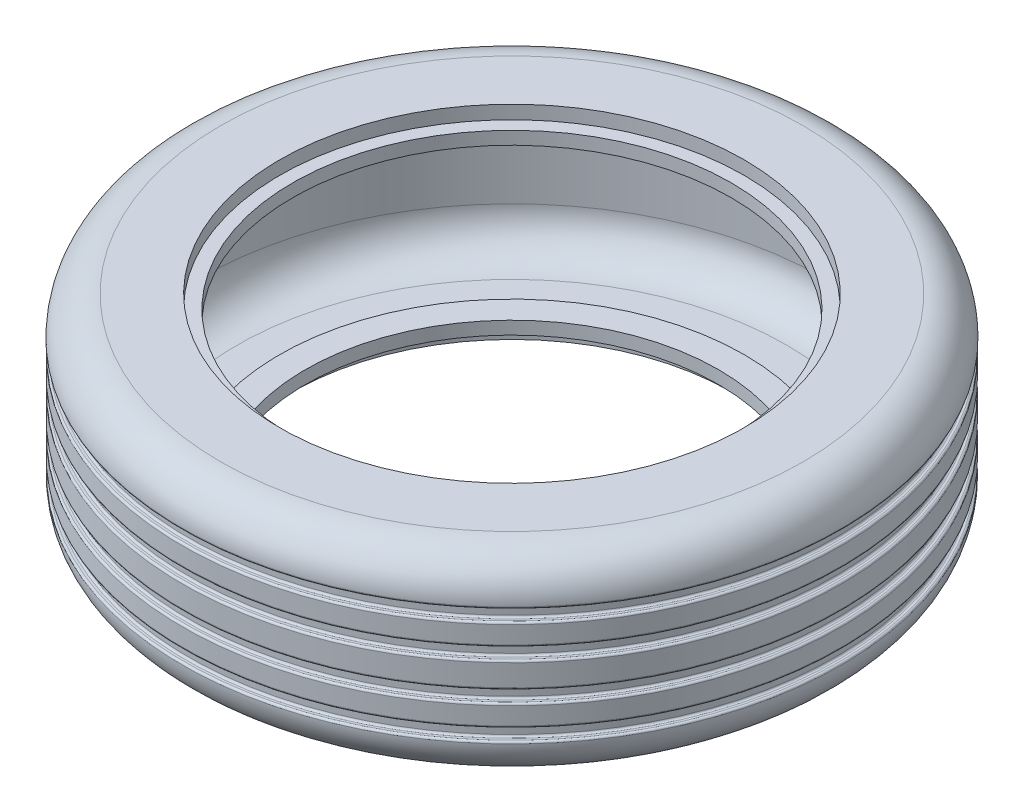
ISO-10303-21;
HEADER;
FILE_DESCRIPTION(('STEP AP214'),'2;1');
FILE_NAME('part.step','',(''),(''),'','','');
FILE_SCHEMA(('AUTOMOTIVE_DESIGN { 1 0 10303 214 1 1 1 1 }'));
ENDSEC;
DATA;
#1=APPLICATION_CONTEXT('core data for automotive mechanical design processes');
#2=APPLICATION_PROTOCOL_DEFINITION('international standard','automotive_design',2000,#1);
#3=PRODUCT_CONTEXT('',#1,'mechanical');
#4=PRODUCT('Part','Part','',(#3));
#5=PRODUCT_RELATED_PRODUCT_CATEGORY('part','',(#4));
#6=PRODUCT_DEFINITION_FORMATION('','',#4);
#7=PRODUCT_DEFINITION_CONTEXT('part definition',#1,'design');
#8=PRODUCT_DEFINITION('design','',#6,#7);
#9=PRODUCT_DEFINITION_SHAPE('','',#8);
#10=(LENGTH_UNIT() NAMED_UNIT(*) SI_UNIT(.MILLI.,.METRE.));
#11=(NAMED_UNIT(*) PLANE_ANGLE_UNIT() SI_UNIT($,.RADIAN.));
#12=(NAMED_UNIT(*) SI_UNIT($,.STERADIAN.) SOLID_ANGLE_UNIT());
#13=UNCERTAINTY_MEASURE_WITH_UNIT(LENGTH_MEASURE(1.E-05),#10,'distance_accuracy_value','');
#14=(GEOMETRIC_REPRESENTATION_CONTEXT(3) GLOBAL_UNCERTAINTY_ASSIGNED_CONTEXT((#13)) GLOBAL_UNIT_ASSIGNED_CONTEXT((#10,
#11,#12)) REPRESENTATION_CONTEXT('',''));
#15=CARTESIAN_POINT('',(0.,0.,0.));
#16=DIRECTION('',(0.,0.,1.));
#17=DIRECTION('',(1.,0.,0.));
#18=AXIS2_PLACEMENT_3D('',#15,#16,#17);
#19=CARTESIAN_POINT('',(0.,50.4745167200062,204.0325899541));
#20=DIRECTION('',(0.,1.,0.));
#21=DIRECTION('',(0.,0.,1.));
#22=AXIS2_PLACEMENT_3D('',#19,#20,#21);
#23=PLANE('',#22);
#24=CARTESIAN_POINT('',(0.,50.4745167200062,-135.611854490345));
#25=DIRECTION('',(0.,-1.,0.));
#26=DIRECTION('',(0.,0.,-1.));
#27=AXIS2_PLACEMENT_3D('',#24,#25,#26);
#28=CIRCLE('',#27,339.644444444444);
#29=CARTESIAN_POINT('',(0.,50.4745167200062,-475.256298934789));
#30=VERTEX_POINT('',#29);
#31=EDGE_CURVE('E246',#30,#30,#28,.T.);
#32=ORIENTED_EDGE('',*,*,#31,.F.);
#33=EDGE_LOOP('',(#32));
#34=FACE_BOUND('',#33,.T.);
#35=CARTESIAN_POINT('',(0.,50.4745167200062,-135.611854490345));
#36=DIRECTION('',(0.,-1.,0.));
#37=DIRECTION('',(0.,0.,-1.));
#38=AXIS2_PLACEMENT_3D('',#35,#36,#37);
#39=CIRCLE('',#38,379.644444444444);
#40=CARTESIAN_POINT('',(0.,50.4745167200062,-515.256298934789));
#41=VERTEX_POINT('',#40);
#42=EDGE_CURVE('E10',#41,#41,#39,.T.);
#43=ORIENTED_EDGE('',*,*,#42,.T.);
#44=EDGE_LOOP('',(#43));
#45=FACE_BOUND('',#44,.T.);
#46=ADVANCED_FACE('F43',(#34,#45),#23,.F.);
#47=CARTESIAN_POINT('',(0.,-170.345483279994,-135.611854490345));
#48=DIRECTION('',(0.,-1.,0.));
#49=DIRECTION('',(0.,0.,-1.));
#50=AXIS2_PLACEMENT_3D('',#47,#48,#49);
#51=CYLINDRICAL_SURFACE('',#50,379.644444444444);
#52=ORIENTED_EDGE('',*,*,#42,.F.);
#53=EDGE_LOOP('',(#52));
#54=FACE_BOUND('',#53,.T.);
#55=CARTESIAN_POINT('',(0.,70.4745167200063,-135.611854490345));
#56=DIRECTION('',(0.,-1.,0.));
#57=DIRECTION('',(0.,0.,-1.));
#58=AXIS2_PLACEMENT_3D('',#55,#56,#57);
#59=CIRCLE('',#58,379.644444444444);
#60=CARTESIAN_POINT('',(0.,70.4745167200063,-515.256298934789));
#61=VERTEX_POINT('',#60);
#62=EDGE_CURVE('E50',#61,#61,#59,.T.);
#63=ORIENTED_EDGE('',*,*,#62,.T.);
#64=EDGE_LOOP('',(#63));
#65=FACE_BOUND('',#64,.T.);
#66=ADVANCED_FACE('F254',(#54,#65),#51,.T.);
#67=CARTESIAN_POINT('',(0.,70.4745167200063,244.0325899541));
#68=DIRECTION('',(0.,1.,0.));
#69=DIRECTION('',(0.,0.,1.));
#70=AXIS2_PLACEMENT_3D('',#67,#68,#69);
#71=PLANE('',#70);
#72=ORIENTED_EDGE('',*,*,#62,.F.);
#73=EDGE_LOOP('',(#72));
#74=FACE_BOUND('',#73,.T.);
#75=CARTESIAN_POINT('',(0.,70.4745167200063,-135.611854490345));
#76=DIRECTION('',(0.,-1.,0.));
#77=DIRECTION('',(0.,0.,-1.));
#78=AXIS2_PLACEMENT_3D('',#75,#76,#77);
#79=CIRCLE('',#78,425.644444444444);
#80=CARTESIAN_POINT('',(0.,70.4745167200063,-561.256298934789));
#81=VERTEX_POINT('',#80);
#82=EDGE_CURVE('E55',#81,#81,#79,.T.);
#83=ORIENTED_EDGE('',*,*,#82,.T.);
#84=EDGE_LOOP('',(#83));
#85=FACE_BOUND('',#84,.T.);
#86=ADVANCED_FACE('F258',(#74,#85),#71,.F.);
#87=CARTESIAN_POINT('',(0.,11.0645167200063,-135.611854490345));
#88=DIRECTION('',(0.,-1.,0.));
#89=DIRECTION('',(0.,0.,-1.));
#90=AXIS2_PLACEMENT_3D('',#87,#88,#89);
#91=TOROIDAL_SURFACE('',#90,425.644444444444,59.41);
#92=ORIENTED_EDGE('',*,*,#82,.F.);
#93=EDGE_LOOP('',(#92));
#94=FACE_BOUND('',#93,.T.);
#95=CARTESIAN_POINT('',(0.,11.0645167200063,-135.611854490345));
#96=DIRECTION('',(0.,-1.,0.));
#97=DIRECTION('',(0.,0.,-1.));
#98=AXIS2_PLACEMENT_3D('',#95,#96,#97);
#99=CIRCLE('',#98,485.054444444444);
#100=CARTESIAN_POINT('',(0.,11.0645167200063,-620.666298934789));
#101=VERTEX_POINT('',#100);
#102=EDGE_CURVE('E60',#101,#101,#99,.T.);
#103=ORIENTED_EDGE('',*,*,#102,.T.);
#104=EDGE_LOOP('',(#103));
#105=FACE_BOUND('',#104,.T.);
#106=ADVANCED_FACE('F263',(#94,#105),#91,.F.);
#107=CARTESIAN_POINT('',(0.,-170.345483279994,-135.611854490345));
#108=DIRECTION('',(0.,-1.,0.));
#109=DIRECTION('',(0.,0.,-1.));
#110=AXIS2_PLACEMENT_3D('',#107,#108,#109);
#111=CYLINDRICAL_SURFACE('',#110,485.054444444444);
#112=ORIENTED_EDGE('',*,*,#102,.F.);
#113=EDGE_LOOP('',(#112));
#114=FACE_BOUND('',#113,.T.);
#115=CARTESIAN_POINT('',(0.,-130.935483279994,-135.611854490345));
#116=DIRECTION('',(0.,-1.,0.));
#117=DIRECTION('',(0.,0.,-1.));
#118=AXIS2_PLACEMENT_3D('',#115,#116,#117);
#119=CIRCLE('',#118,485.054444444444);
#120=CARTESIAN_POINT('',(0.,-130.935483279994,-620.666298934789));
#121=VERTEX_POINT('',#120);
#122=EDGE_CURVE('E66',#121,#121,#119,.T.);
#123=ORIENTED_EDGE('',*,*,#122,.T.);
#124=EDGE_LOOP('',(#123));
#125=FACE_BOUND('',#124,.T.);
#126=ADVANCED_FACE('F269',(#114,#125),#111,.F.);
#127=CARTESIAN_POINT('',(0.,-130.935483279994,-135.611854490345));
#128=DIRECTION('',(0.,-1.,0.));
#129=DIRECTION('',(0.,0.,-1.));
#130=AXIS2_PLACEMENT_3D('',#127,#128,#129);
#131=TOROIDAL_SURFACE('',#130,425.644444444444,59.41);
#132=ORIENTED_EDGE('',*,*,#122,.F.);
#133=EDGE_LOOP('',(#132));
#134=FACE_BOUND('',#133,.T.);
#135=CARTESIAN_POINT('',(0.,-190.345483279994,-135.611854490345));
#136=DIRECTION('',(0.,-1.,0.));
#137=DIRECTION('',(0.,0.,-1.));
#138=AXIS2_PLACEMENT_3D('',#135,#136,#137);
#139=CIRCLE('',#138,425.644444444444);
#140=CARTESIAN_POINT('',(0.,-190.345483279994,-561.256298934789));
#141=VERTEX_POINT('',#140);
#142=EDGE_CURVE('E70',#141,#141,#139,.T.);
#143=ORIENTED_EDGE('',*,*,#142,.T.);
#144=EDGE_LOOP('',(#143));
#145=FACE_BOUND('',#144,.T.);
#146=ADVANCED_FACE('F273',(#134,#145),#131,.F.);
#147=CARTESIAN_POINT('',(0.,-190.345483279994,224.388145509655));
#148=DIRECTION('',(0.,-1.,0.));
#149=DIRECTION('',(0.,0.,-1.));
#150=AXIS2_PLACEMENT_3D('',#147,#148,#149);
#151=PLANE('',#150);
#152=ORIENTED_EDGE('',*,*,#142,.F.);
#153=EDGE_LOOP('',(#152));
#154=FACE_BOUND('',#153,.T.);
#155=CARTESIAN_POINT('',(0.,-190.345483279994,-135.611854490345));
#156=DIRECTION('',(0.,-1.,0.));
#157=DIRECTION('',(0.,0.,-1.));
#158=AXIS2_PLACEMENT_3D('',#155,#156,#157);
#159=CIRCLE('',#158,360.);
#160=CARTESIAN_POINT('',(0.,-190.345483279994,-495.611854490345));
#161=VERTEX_POINT('',#160);
#162=EDGE_CURVE('E74',#161,#161,#159,.T.);
#163=ORIENTED_EDGE('',*,*,#162,.T.);
#164=EDGE_LOOP('',(#163));
#165=FACE_BOUND('',#164,.T.);
#166=ADVANCED_FACE('F277',(#154,#165),#151,.F.);
#167=CARTESIAN_POINT('',(0.,-170.345483279994,-135.611854490345));
#168=DIRECTION('',(0.,-1.,0.));
#169=DIRECTION('',(0.,0.,-1.));
#170=AXIS2_PLACEMENT_3D('',#167,#168,#169);
#171=CYLINDRICAL_SURFACE('',#170,360.);
#172=ORIENTED_EDGE('',*,*,#162,.F.);
#173=EDGE_LOOP('',(#172));
#174=FACE_BOUND('',#173,.T.);
#175=CARTESIAN_POINT('',(0.,-170.345483279994,-135.611854490345));
#176=DIRECTION('',(0.,-1.,0.));
#177=DIRECTION('',(0.,0.,-1.));
#178=AXIS2_PLACEMENT_3D('',#175,#176,#177);
#179=CIRCLE('',#178,360.);
#180=CARTESIAN_POINT('',(0.,-170.345483279994,-495.611854490345));
#181=VERTEX_POINT('',#180);
#182=EDGE_CURVE('E78',#181,#181,#179,.T.);
#183=ORIENTED_EDGE('',*,*,#182,.T.);
#184=EDGE_LOOP('',(#183));
#185=FACE_BOUND('',#184,.T.);
#186=ADVANCED_FACE('F281',(#174,#185),#171,.T.);
#187=CARTESIAN_POINT('',(0.,-170.345483279994,184.388145509655));
#188=DIRECTION('',(0.,-1.,0.));
#189=DIRECTION('',(0.,0.,-1.));
#190=AXIS2_PLACEMENT_3D('',#187,#188,#189);
#191=PLANE('',#190);
#192=ORIENTED_EDGE('',*,*,#182,.F.);
#193=EDGE_LOOP('',(#192));
#194=FACE_BOUND('',#193,.T.);
#195=CARTESIAN_POINT('',(0.,-170.345483279994,-135.611854490345));
#196=DIRECTION('',(0.,-1.,0.));
#197=DIRECTION('',(0.,0.,-1.));
#198=AXIS2_PLACEMENT_3D('',#195,#196,#197);
#199=CIRCLE('',#198,320.);
#200=CARTESIAN_POINT('',(0.,-170.345483279994,-455.611854490345));
#201=VERTEX_POINT('',#200);
#202=EDGE_CURVE('E82',#201,#201,#199,.T.);
#203=ORIENTED_EDGE('',*,*,#202,.T.);
#204=EDGE_LOOP('',(#203));
#205=FACE_BOUND('',#204,.T.);
#206=ADVANCED_FACE('F285',(#194,#205),#191,.F.);
#207=CARTESIAN_POINT('',(0.,-170.345483279994,-135.611854490345));
#208=DIRECTION('',(0.,-1.,0.));
#209=DIRECTION('',(0.,0.,-1.));
#210=AXIS2_PLACEMENT_3D('',#207,#208,#209);
#211=CYLINDRICAL_SURFACE('',#210,320.);
#212=ORIENTED_EDGE('',*,*,#202,.F.);
#213=EDGE_LOOP('',(#212));
#214=FACE_BOUND('',#213,.T.);
#215=CARTESIAN_POINT('',(0.,-190.345483279994,-135.611854490345));
#216=DIRECTION('',(0.,-1.,0.));
#217=DIRECTION('',(0.,0.,-1.));
#218=AXIS2_PLACEMENT_3D('',#215,#216,#217);
#219=CIRCLE('',#218,320.);
#220=CARTESIAN_POINT('',(0.,-190.345483279994,-455.611854490345));
#221=VERTEX_POINT('',#220);
#222=EDGE_CURVE('E86',#221,#221,#219,.T.);
#223=ORIENTED_EDGE('',*,*,#222,.T.);
#224=EDGE_LOOP('',(#223));
#225=FACE_BOUND('',#224,.T.);
#226=ADVANCED_FACE('F289',(#214,#225),#211,.F.);
#227=CARTESIAN_POINT('',(0.,-190.345483279994,204.388145509655));
#228=DIRECTION('',(0.,1.,0.));
#229=DIRECTION('',(0.,0.,1.));
#230=AXIS2_PLACEMENT_3D('',#227,#228,#229);
#231=PLANE('',#230);
#232=ORIENTED_EDGE('',*,*,#222,.F.);
#233=EDGE_LOOP('',(#232));
#234=FACE_BOUND('',#233,.T.);
#235=CARTESIAN_POINT('',(0.,-190.345483279994,-135.611854490345));
#236=DIRECTION('',(0.,-1.,0.));
#237=DIRECTION('',(0.,0.,-1.));
#238=AXIS2_PLACEMENT_3D('',#235,#236,#237);
#239=CIRCLE('',#238,340.);
#240=CARTESIAN_POINT('',(0.,-190.345483279994,-475.611854490345));
#241=VERTEX_POINT('',#240);
#242=EDGE_CURVE('E90',#241,#241,#239,.T.);
#243=ORIENTED_EDGE('',*,*,#242,.T.);
#244=EDGE_LOOP('',(#243));
#245=FACE_BOUND('',#244,.T.);
#246=ADVANCED_FACE('F293',(#234,#245),#231,.F.);
#247=CARTESIAN_POINT('',(0.,-170.345483279994,-135.611854490345));
#248=DIRECTION('',(0.,-1.,0.));
#249=DIRECTION('',(0.,0.,-1.));
#250=AXIS2_PLACEMENT_3D('',#247,#248,#249);
#251=CYLINDRICAL_SURFACE('',#250,340.);
#252=ORIENTED_EDGE('',*,*,#242,.F.);
#253=EDGE_LOOP('',(#252));
#254=FACE_BOUND('',#253,.T.);
#255=CARTESIAN_POINT('',(0.,-210.345483279994,-135.611854490345));
#256=DIRECTION('',(0.,-1.,0.));
#257=DIRECTION('',(0.,0.,-1.));
#258=AXIS2_PLACEMENT_3D('',#255,#256,#257);
#259=CIRCLE('',#258,340.);
#260=CARTESIAN_POINT('',(0.,-210.345483279994,-475.611854490345));
#261=VERTEX_POINT('',#260);
#262=EDGE_CURVE('E94',#261,#261,#259,.T.);
#263=ORIENTED_EDGE('',*,*,#262,.T.);
#264=EDGE_LOOP('',(#263));
#265=FACE_BOUND('',#264,.T.);
#266=ADVANCED_FACE('F297',(#254,#265),#251,.F.);
#267=CARTESIAN_POINT('',(0.,-210.345483279994,315.032589954099));
#268=DIRECTION('',(0.,1.,0.));
#269=DIRECTION('',(0.,0.,1.));
#270=AXIS2_PLACEMENT_3D('',#267,#268,#269);
#271=PLANE('',#270);
#272=ORIENTED_EDGE('',*,*,#262,.F.);
#273=EDGE_LOOP('',(#272));
#274=FACE_BOUND('',#273,.T.);
#275=CARTESIAN_POINT('',(0.,-210.345483279994,-135.611854490345));
#276=DIRECTION('',(0.,-1.,0.));
#277=DIRECTION('',(0.,0.,-1.));
#278=AXIS2_PLACEMENT_3D('',#275,#276,#277);
#279=CIRCLE('',#278,450.644444444444);
#280=CARTESIAN_POINT('',(0.,-210.345483279994,-586.256298934789));
#281=VERTEX_POINT('',#280);
#282=EDGE_CURVE('E98',#281,#281,#279,.T.);
#283=ORIENTED_EDGE('',*,*,#282,.T.);
#284=EDGE_LOOP('',(#283));
#285=FACE_BOUND('',#284,.T.);
#286=ADVANCED_FACE('F301',(#274,#285),#271,.F.);
#287=CARTESIAN_POINT('',(0.,-150.935483279994,-135.611854490345));
#288=DIRECTION('',(0.,-1.,0.));
#289=DIRECTION('',(0.,0.,-1.));
#290=AXIS2_PLACEMENT_3D('',#287,#288,#289);
#291=TOROIDAL_SURFACE('',#290,450.644444444444,59.41);
#292=ORIENTED_EDGE('',*,*,#282,.F.);
#293=EDGE_LOOP('',(#292));
#294=FACE_BOUND('',#293,.T.);
#295=CARTESIAN_POINT('',(0.,-151.996376137136,-135.611854490345));
#296=DIRECTION('',(0.,-1.,0.));
#297=DIRECTION('',(0.,0.,-1.));
#298=AXIS2_PLACEMENT_3D('',#295,#296,#297);
#299=CIRCLE('',#298,510.044971431548);
#300=CARTESIAN_POINT('',(0.,-151.996376137136,-645.656825921893));
#301=VERTEX_POINT('',#300);
#302=EDGE_CURVE('E102',#301,#301,#299,.T.);
#303=ORIENTED_EDGE('',*,*,#302,.T.);
#304=EDGE_LOOP('',(#303));
#305=FACE_BOUND('',#304,.T.);
#306=ADVANCED_FACE('F305',(#294,#305),#291,.T.);
#307=CARTESIAN_POINT('',(0.,-151.942804708565,-135.611854490345));
#308=DIRECTION('',(0.,-1.,0.));
#309=DIRECTION('',(0.,0.,-1.));
#310=AXIS2_PLACEMENT_3D('',#307,#308,#309);
#311=TOROIDAL_SURFACE('',#310,507.045449786012,3.00000000000001);
#312=ORIENTED_EDGE('',*,*,#302,.F.);
#313=EDGE_LOOP('',(#312));
#314=FACE_BOUND('',#313,.T.);
#315=CARTESIAN_POINT('',(0.,-148.942804708565,-135.611854490345));
#316=DIRECTION('',(0.,-1.,0.));
#317=DIRECTION('',(0.,0.,-1.));
#318=AXIS2_PLACEMENT_3D('',#315,#316,#317);
#319=CIRCLE('',#318,507.045449786012);
#320=CARTESIAN_POINT('',(0.,-148.942804708565,-642.657304276357));
#321=VERTEX_POINT('',#320);
#322=EDGE_CURVE('E106',#321,#321,#319,.T.);
#323=ORIENTED_EDGE('',*,*,#322,.T.);
#324=EDGE_LOOP('',(#323));
#325=FACE_BOUND('',#324,.T.);
#326=ADVANCED_FACE('F309',(#314,#325),#311,.T.);
#327=CARTESIAN_POINT('',(0.,-148.942804708565,371.433595295667));
#328=DIRECTION('',(0.,-1.,0.));
#329=DIRECTION('',(0.,0.,-1.));
#330=AXIS2_PLACEMENT_3D('',#327,#328,#329);
#331=PLANE('',#330);
#332=ORIENTED_EDGE('',*,*,#322,.F.);
#333=EDGE_LOOP('',(#332));
#334=FACE_BOUND('',#333,.T.);
#335=CARTESIAN_POINT('',(0.,-148.942804708565,-135.611854490345));
#336=DIRECTION('',(0.,-1.,0.));
#337=DIRECTION('',(0.,0.,-1.));
#338=AXIS2_PLACEMENT_3D('',#335,#336,#337);
#339=CIRCLE('',#338,503.565870994142);
#340=CARTESIAN_POINT('',(0.,-148.942804708565,-639.177725484487));
#341=VERTEX_POINT('',#340);
#342=EDGE_CURVE('E110',#341,#341,#339,.T.);
#343=ORIENTED_EDGE('',*,*,#342,.T.);
#344=EDGE_LOOP('',(#343));
#345=FACE_BOUND('',#344,.T.);
#346=ADVANCED_FACE('F313',(#334,#345),#331,.F.);
#347=CARTESIAN_POINT('',(0.,-145.942804708565,-135.611854490345));
#348=DIRECTION('',(0.,-1.,0.));
#349=DIRECTION('',(0.,0.,-1.));
#350=AXIS2_PLACEMENT_3D('',#347,#348,#349);
#351=TOROIDAL_SURFACE('',#350,503.565870994142,3.);
#352=ORIENTED_EDGE('',*,*,#342,.F.);
#353=EDGE_LOOP('',(#352));
#354=FACE_BOUND('',#353,.T.);
#355=CARTESIAN_POINT('',(0.,-145.942804708565,-135.611854490345));
#356=DIRECTION('',(0.,-1.,0.));
#357=DIRECTION('',(0.,0.,-1.));
#358=AXIS2_PLACEMENT_3D('',#355,#356,#357);
#359=CIRCLE('',#358,500.565870994142);
#360=CARTESIAN_POINT('',(0.,-145.942804708565,-636.177725484487));
#361=VERTEX_POINT('',#360);
#362=EDGE_CURVE('E114',#361,#361,#359,.T.);
#363=ORIENTED_EDGE('',*,*,#362,.T.);
#364=EDGE_LOOP('',(#363));
#365=FACE_BOUND('',#364,.T.);
#366=ADVANCED_FACE('F317',(#354,#365),#351,.F.);
#367=CARTESIAN_POINT('',(0.,-170.345483279994,-135.611854490345));
#368=DIRECTION('',(0.,-1.,0.));
#369=DIRECTION('',(0.,0.,-1.));
#370=AXIS2_PLACEMENT_3D('',#367,#368,#369);
#371=CYLINDRICAL_SURFACE('',#370,500.565870994142);
#372=ORIENTED_EDGE('',*,*,#362,.F.);
#373=EDGE_LOOP('',(#372));
#374=FACE_BOUND('',#373,.T.);
#375=CARTESIAN_POINT('',(0.,-133.942804708565,-135.611854490345));
#376=DIRECTION('',(0.,-1.,0.));
#377=DIRECTION('',(0.,0.,-1.));
#378=AXIS2_PLACEMENT_3D('',#375,#376,#377);
#379=CIRCLE('',#378,500.565870994142);
#380=CARTESIAN_POINT('',(0.,-133.942804708565,-636.177725484487));
#381=VERTEX_POINT('',#380);
#382=EDGE_CURVE('E118',#381,#381,#379,.T.);
#383=ORIENTED_EDGE('',*,*,#382,.T.);
#384=EDGE_LOOP('',(#383));
#385=FACE_BOUND('',#384,.T.);
#386=ADVANCED_FACE('F321',(#374,#385),#371,.T.);
#387=CARTESIAN_POINT('',(0.,-133.942804708565,-135.611854490345));
#388=DIRECTION('',(0.,-1.,0.));
#389=DIRECTION('',(0.,0.,-1.));
#390=AXIS2_PLACEMENT_3D('',#387,#388,#389);
#391=TOROIDAL_SURFACE('',#390,503.565870994142,2.99999999999999);
#392=ORIENTED_EDGE('',*,*,#382,.F.);
#393=EDGE_LOOP('',(#392));
#394=FACE_BOUND('',#393,.T.);
#395=CARTESIAN_POINT('',(0.,-130.942804708565,-135.611854490345));
#396=DIRECTION('',(0.,-1.,0.));
#397=DIRECTION('',(0.,0.,-1.));
#398=AXIS2_PLACEMENT_3D('',#395,#396,#397);
#399=CIRCLE('',#398,503.565870994142);
#400=CARTESIAN_POINT('',(0.,-130.942804708565,-639.177725484487));
#401=VERTEX_POINT('',#400);
#402=EDGE_CURVE('E122',#401,#401,#399,.T.);
#403=ORIENTED_EDGE('',*,*,#402,.T.);
#404=EDGE_LOOP('',(#403));
#405=FACE_BOUND('',#404,.T.);
#406=ADVANCED_FACE('F325',(#394,#405),#391,.F.);
#407=CARTESIAN_POINT('',(0.,-130.942804708565,371.442524578989));
#408=DIRECTION('',(0.,1.,0.));
#409=DIRECTION('',(0.,0.,1.));
#410=AXIS2_PLACEMENT_3D('',#407,#408,#409);
#411=PLANE('',#410);
#412=ORIENTED_EDGE('',*,*,#402,.F.);
#413=EDGE_LOOP('',(#412));
#414=FACE_BOUND('',#413,.T.);
#415=CARTESIAN_POINT('',(0.,-130.942804708565,-135.611854490345));
#416=DIRECTION('',(0.,-1.,0.));
#417=DIRECTION('',(0.,0.,-1.));
#418=AXIS2_PLACEMENT_3D('',#415,#416,#417);
#419=CIRCLE('',#418,507.054379069334);
#420=CARTESIAN_POINT('',(0.,-130.942804708565,-642.666233559679));
#421=VERTEX_POINT('',#420);
#422=EDGE_CURVE('E126',#421,#421,#419,.T.);
#423=ORIENTED_EDGE('',*,*,#422,.T.);
#424=EDGE_LOOP('',(#423));
#425=FACE_BOUND('',#424,.T.);
#426=ADVANCED_FACE('F329',(#414,#425),#411,.F.);
#427=CARTESIAN_POINT('',(0.,-127.942804708565,-135.611854490345));
#428=DIRECTION('',(0.,-1.,0.));
#429=DIRECTION('',(0.,0.,-1.));
#430=AXIS2_PLACEMENT_3D('',#427,#428,#429);
#431=TOROIDAL_SURFACE('',#430,507.054379069334,3.);
#432=ORIENTED_EDGE('',*,*,#422,.F.);
#433=EDGE_LOOP('',(#432));
#434=FACE_BOUND('',#433,.T.);
#435=CARTESIAN_POINT('',(0.,-127.942804708565,-135.611854490345));
#436=DIRECTION('',(0.,-1.,0.));
#437=DIRECTION('',(0.,0.,-1.));
#438=AXIS2_PLACEMENT_3D('',#435,#436,#437);
#439=CIRCLE('',#438,510.054379069334);
#440=CARTESIAN_POINT('',(0.,-127.942804708565,-645.666233559679));
#441=VERTEX_POINT('',#440);
#442=EDGE_CURVE('E130',#441,#441,#439,.T.);
#443=ORIENTED_EDGE('',*,*,#442,.T.);
#444=EDGE_LOOP('',(#443));
#445=FACE_BOUND('',#444,.T.);
#446=ADVANCED_FACE('F333',(#434,#445),#431,.T.);
#447=CARTESIAN_POINT('',(0.,-170.345483279994,-135.611854490345));
#448=DIRECTION('',(0.,-1.,0.));
#449=DIRECTION('',(0.,0.,-1.));
#450=AXIS2_PLACEMENT_3D('',#447,#448,#449);
#451=CYLINDRICAL_SURFACE('',#450,510.054379069334);
#452=ORIENTED_EDGE('',*,*,#442,.F.);
#453=EDGE_LOOP('',(#452));
#454=FACE_BOUND('',#453,.T.);
#455=CARTESIAN_POINT('',(0.,-100.702405070749,-135.611854490345));
#456=DIRECTION('',(0.,-1.,0.));
#457=DIRECTION('',(0.,0.,-1.));
#458=AXIS2_PLACEMENT_3D('',#455,#456,#457);
#459=CIRCLE('',#458,510.054379069334);
#460=CARTESIAN_POINT('',(0.,-100.702405070749,-645.666233559679));
#461=VERTEX_POINT('',#460);
#462=EDGE_CURVE('E134',#461,#461,#459,.T.);
#463=ORIENTED_EDGE('',*,*,#462,.T.);
#464=EDGE_LOOP('',(#463));
#465=FACE_BOUND('',#464,.T.);
#466=ADVANCED_FACE('F337',(#454,#465),#451,.T.);
#467=CARTESIAN_POINT('',(0.,-100.702405070749,-135.611854490345));
#468=DIRECTION('',(0.,-1.,0.));
#469=DIRECTION('',(0.,0.,-1.));
#470=AXIS2_PLACEMENT_3D('',#467,#468,#469);
#471=TOROIDAL_SURFACE('',#470,507.054379069334,3.);
#472=ORIENTED_EDGE('',*,*,#462,.F.);
#473=EDGE_LOOP('',(#472));
#474=FACE_BOUND('',#473,.T.);
#475=CARTESIAN_POINT('',(0.,-97.7024050707495,-135.611854490345));
#476=DIRECTION('',(0.,-1.,0.));
#477=DIRECTION('',(0.,0.,-1.));
#478=AXIS2_PLACEMENT_3D('',#475,#476,#477);
#479=CIRCLE('',#478,507.054379069334);
#480=CARTESIAN_POINT('',(0.,-97.7024050707495,-642.666233559679));
#481=VERTEX_POINT('',#480);
#482=EDGE_CURVE('E138',#481,#481,#479,.T.);
#483=ORIENTED_EDGE('',*,*,#482,.T.);
#484=EDGE_LOOP('',(#483));
#485=FACE_BOUND('',#484,.T.);
#486=ADVANCED_FACE('F341',(#474,#485),#471,.T.);
#487=CARTESIAN_POINT('',(0.,-97.7024050707495,371.442524578989));
#488=DIRECTION('',(0.,-1.,0.));
#489=DIRECTION('',(0.,0.,-1.));
#490=AXIS2_PLACEMENT_3D('',#487,#488,#489);
#491=PLANE('',#490);
#492=ORIENTED_EDGE('',*,*,#482,.F.);
#493=EDGE_LOOP('',(#492));
#494=FACE_BOUND('',#493,.T.);
#495=CARTESIAN_POINT('',(0.,-97.7024050707494,-135.611854490345));
#496=DIRECTION('',(0.,-1.,0.));
#497=DIRECTION('',(0.,0.,-1.));
#498=AXIS2_PLACEMENT_3D('',#495,#496,#497);
#499=CIRCLE('',#498,503.565870994142);
#500=CARTESIAN_POINT('',(0.,-97.7024050707494,-639.177725484487));
#501=VERTEX_POINT('',#500);
#502=EDGE_CURVE('E142',#501,#501,#499,.T.);
#503=ORIENTED_EDGE('',*,*,#502,.T.);
#504=EDGE_LOOP('',(#503));
#505=FACE_BOUND('',#504,.T.);
#506=ADVANCED_FACE('F345',(#494,#505),#491,.F.);
#507=CARTESIAN_POINT('',(0.,-94.7024050707495,-135.611854490345));
#508=DIRECTION('',(0.,-1.,0.));
#509=DIRECTION('',(0.,0.,-1.));
#510=AXIS2_PLACEMENT_3D('',#507,#508,#509);
#511=TOROIDAL_SURFACE('',#510,503.565870994142,2.99999999999998);
#512=ORIENTED_EDGE('',*,*,#502,.F.);
#513=EDGE_LOOP('',(#512));
#514=FACE_BOUND('',#513,.T.);
#515=CARTESIAN_POINT('',(0.,-94.7024050707495,-135.611854490345));
#516=DIRECTION('',(0.,-1.,0.));
#517=DIRECTION('',(0.,0.,-1.));
#518=AXIS2_PLACEMENT_3D('',#515,#516,#517);
#519=CIRCLE('',#518,500.565870994142);
#520=CARTESIAN_POINT('',(0.,-94.7024050707495,-636.177725484487));
#521=VERTEX_POINT('',#520);
#522=EDGE_CURVE('E146',#521,#521,#519,.T.);
#523=ORIENTED_EDGE('',*,*,#522,.T.);
#524=EDGE_LOOP('',(#523));
#525=FACE_BOUND('',#524,.T.);
#526=ADVANCED_FACE('F349',(#514,#525),#511,.F.);
#527=CARTESIAN_POINT('',(0.,-170.345483279994,-135.611854490345));
#528=DIRECTION('',(0.,-1.,0.));
#529=DIRECTION('',(0.,0.,-1.));
#530=AXIS2_PLACEMENT_3D('',#527,#528,#529);
#531=CYLINDRICAL_SURFACE('',#530,500.565870994142);
#532=ORIENTED_EDGE('',*,*,#522,.F.);
#533=EDGE_LOOP('',(#532));
#534=FACE_BOUND('',#533,.T.);
#535=CARTESIAN_POINT('',(0.,-82.7024050707495,-135.611854490345));
#536=DIRECTION('',(0.,-1.,0.));
#537=DIRECTION('',(0.,0.,-1.));
#538=AXIS2_PLACEMENT_3D('',#535,#536,#537);
#539=CIRCLE('',#538,500.565870994142);
#540=CARTESIAN_POINT('',(0.,-82.7024050707495,-636.177725484487));
#541=VERTEX_POINT('',#540);
#542=EDGE_CURVE('E150',#541,#541,#539,.T.);
#543=ORIENTED_EDGE('',*,*,#542,.T.);
#544=EDGE_LOOP('',(#543));
#545=FACE_BOUND('',#544,.T.);
#546=ADVANCED_FACE('F353',(#534,#545),#531,.T.);
#547=CARTESIAN_POINT('',(0.,-82.7024050707495,-135.611854490345));
#548=DIRECTION('',(0.,-1.,0.));
#549=DIRECTION('',(0.,0.,-1.));
#550=AXIS2_PLACEMENT_3D('',#547,#548,#549);
#551=TOROIDAL_SURFACE('',#550,503.565870994142,3.);
#552=ORIENTED_EDGE('',*,*,#542,.F.);
#553=EDGE_LOOP('',(#552));
#554=FACE_BOUND('',#553,.T.);
#555=CARTESIAN_POINT('',(0.,-79.7024050707495,-135.611854490345));
#556=DIRECTION('',(0.,-1.,0.));
#557=DIRECTION('',(0.,0.,-1.));
#558=AXIS2_PLACEMENT_3D('',#555,#556,#557);
#559=CIRCLE('',#558,503.565870994142);
#560=CARTESIAN_POINT('',(0.,-79.7024050707495,-639.177725484487));
#561=VERTEX_POINT('',#560);
#562=EDGE_CURVE('E154',#561,#561,#559,.T.);
#563=ORIENTED_EDGE('',*,*,#562,.T.);
#564=EDGE_LOOP('',(#563));
#565=FACE_BOUND('',#564,.T.);
#566=ADVANCED_FACE('F357',(#554,#565),#551,.F.);
#567=CARTESIAN_POINT('',(0.,-79.7024050707495,371.442524578989));
#568=DIRECTION('',(0.,1.,0.));
#569=DIRECTION('',(0.,0.,1.));
#570=AXIS2_PLACEMENT_3D('',#567,#568,#569);
#571=PLANE('',#570);
#572=ORIENTED_EDGE('',*,*,#562,.F.);
#573=EDGE_LOOP('',(#572));
#574=FACE_BOUND('',#573,.T.);
#575=CARTESIAN_POINT('',(0.,-79.7024050707495,-135.611854490345));
#576=DIRECTION('',(0.,-1.,0.));
#577=DIRECTION('',(0.,0.,-1.));
#578=AXIS2_PLACEMENT_3D('',#575,#576,#577);
#579=CIRCLE('',#578,507.054379069334);
#580=CARTESIAN_POINT('',(0.,-79.7024050707495,-642.666233559679));
#581=VERTEX_POINT('',#580);
#582=EDGE_CURVE('E158',#581,#581,#579,.T.);
#583=ORIENTED_EDGE('',*,*,#582,.T.);
#584=EDGE_LOOP('',(#583));
#585=FACE_BOUND('',#584,.T.);
#586=ADVANCED_FACE('F361',(#574,#585),#571,.F.);
#587=CARTESIAN_POINT('',(0.,-76.7024050707495,-135.611854490345));
#588=DIRECTION('',(0.,-1.,0.));
#589=DIRECTION('',(0.,0.,-1.));
#590=AXIS2_PLACEMENT_3D('',#587,#588,#589);
#591=TOROIDAL_SURFACE('',#590,507.054379069334,3.);
#592=ORIENTED_EDGE('',*,*,#582,.F.);
#593=EDGE_LOOP('',(#592));
#594=FACE_BOUND('',#593,.T.);
#595=CARTESIAN_POINT('',(0.,-76.7024050707495,-135.611854490345));
#596=DIRECTION('',(0.,-1.,0.));
#597=DIRECTION('',(0.,0.,-1.));
#598=AXIS2_PLACEMENT_3D('',#595,#596,#597);
#599=CIRCLE('',#598,510.054379069334);
#600=CARTESIAN_POINT('',(0.,-76.7024050707495,-645.666233559679));
#601=VERTEX_POINT('',#600);
#602=EDGE_CURVE('E162',#601,#601,#599,.T.);
#603=ORIENTED_EDGE('',*,*,#602,.T.);
#604=EDGE_LOOP('',(#603));
#605=FACE_BOUND('',#604,.T.);
#606=ADVANCED_FACE('F365',(#594,#605),#591,.T.);
#607=CARTESIAN_POINT('',(0.,-170.345483279994,-135.611854490345));
#608=DIRECTION('',(0.,-1.,0.));
#609=DIRECTION('',(0.,0.,-1.));
#610=AXIS2_PLACEMENT_3D('',#607,#608,#609);
#611=CYLINDRICAL_SURFACE('',#610,510.054379069334);
#612=ORIENTED_EDGE('',*,*,#602,.F.);
#613=EDGE_LOOP('',(#612));
#614=FACE_BOUND('',#613,.T.);
#615=CARTESIAN_POINT('',(0.,-43.1832043463806,-135.611854490345));
#616=DIRECTION('',(0.,-1.,0.));
#617=DIRECTION('',(0.,0.,-1.));
#618=AXIS2_PLACEMENT_3D('',#615,#616,#617);
#619=CIRCLE('',#618,510.054379069334);
#620=CARTESIAN_POINT('',(0.,-43.1832043463806,-645.666233559679));
#621=VERTEX_POINT('',#620);
#622=EDGE_CURVE('E166',#621,#621,#619,.T.);
#623=ORIENTED_EDGE('',*,*,#622,.T.);
#624=EDGE_LOOP('',(#623));
#625=FACE_BOUND('',#624,.T.);
#626=ADVANCED_FACE('F369',(#614,#625),#611,.T.);
#627=CARTESIAN_POINT('',(0.,-43.1832043463806,-135.611854490345));
#628=DIRECTION('',(0.,-1.,0.));
#629=DIRECTION('',(0.,0.,-1.));
#630=AXIS2_PLACEMENT_3D('',#627,#628,#629);
#631=TOROIDAL_SURFACE('',#630,507.054379069334,3.);
#632=ORIENTED_EDGE('',*,*,#622,.F.);
#633=EDGE_LOOP('',(#632));
#634=FACE_BOUND('',#633,.T.);
#635=CARTESIAN_POINT('',(0.,-40.1832043463806,-135.611854490345));
#636=DIRECTION('',(0.,-1.,0.));
#637=DIRECTION('',(0.,0.,-1.));
#638=AXIS2_PLACEMENT_3D('',#635,#636,#637);
#639=CIRCLE('',#638,507.054379069334);
#640=CARTESIAN_POINT('',(0.,-40.1832043463806,-642.666233559679));
#641=VERTEX_POINT('',#640);
#642=EDGE_CURVE('E170',#641,#641,#639,.T.);
#643=ORIENTED_EDGE('',*,*,#642,.T.);
#644=EDGE_LOOP('',(#643));
#645=FACE_BOUND('',#644,.T.);
#646=ADVANCED_FACE('F373',(#634,#645),#631,.T.);
#647=CARTESIAN_POINT('',(0.,-40.1832043463806,371.442524578989));
#648=DIRECTION('',(0.,-1.,0.));
#649=DIRECTION('',(0.,0.,-1.));
#650=AXIS2_PLACEMENT_3D('',#647,#648,#649);
#651=PLANE('',#650);
#652=ORIENTED_EDGE('',*,*,#642,.F.);
#653=EDGE_LOOP('',(#652));
#654=FACE_BOUND('',#653,.T.);
#655=CARTESIAN_POINT('',(0.,-40.1832043463806,-135.611854490345));
#656=DIRECTION('',(0.,-1.,0.));
#657=DIRECTION('',(0.,0.,-1.));
#658=AXIS2_PLACEMENT_3D('',#655,#656,#657);
#659=CIRCLE('',#658,503.565870994142);
#660=CARTESIAN_POINT('',(0.,-40.1832043463806,-639.177725484487));
#661=VERTEX_POINT('',#660);
#662=EDGE_CURVE('E174',#661,#661,#659,.T.);
#663=ORIENTED_EDGE('',*,*,#662,.T.);
#664=EDGE_LOOP('',(#663));
#665=FACE_BOUND('',#664,.T.);
#666=ADVANCED_FACE('F377',(#654,#665),#651,.F.);
#667=CARTESIAN_POINT('',(0.,-37.1832043463806,-135.611854490345));
#668=DIRECTION('',(0.,-1.,0.));
#669=DIRECTION('',(0.,0.,-1.));
#670=AXIS2_PLACEMENT_3D('',#667,#668,#669);
#671=TOROIDAL_SURFACE('',#670,503.565870994142,3.);
#672=ORIENTED_EDGE('',*,*,#662,.F.);
#673=EDGE_LOOP('',(#672));
#674=FACE_BOUND('',#673,.T.);
#675=CARTESIAN_POINT('',(0.,-37.1832043463806,-135.611854490345));
#676=DIRECTION('',(0.,-1.,0.));
#677=DIRECTION('',(0.,0.,-1.));
#678=AXIS2_PLACEMENT_3D('',#675,#676,#677);
#679=CIRCLE('',#678,500.565870994142);
#680=CARTESIAN_POINT('',(0.,-37.1832043463806,-636.177725484487));
#681=VERTEX_POINT('',#680);
#682=EDGE_CURVE('E178',#681,#681,#679,.T.);
#683=ORIENTED_EDGE('',*,*,#682,.T.);
#684=EDGE_LOOP('',(#683));
#685=FACE_BOUND('',#684,.T.);
#686=ADVANCED_FACE('F381',(#674,#685),#671,.F.);
#687=CARTESIAN_POINT('',(0.,-170.345483279994,-135.611854490345));
#688=DIRECTION('',(0.,-1.,0.));
#689=DIRECTION('',(0.,0.,-1.));
#690=AXIS2_PLACEMENT_3D('',#687,#688,#689);
#691=CYLINDRICAL_SURFACE('',#690,500.565870994142);
#692=ORIENTED_EDGE('',*,*,#682,.F.);
#693=EDGE_LOOP('',(#692));
#694=FACE_BOUND('',#693,.T.);
#695=CARTESIAN_POINT('',(0.,-25.1832043463806,-135.611854490345));
#696=DIRECTION('',(0.,-1.,0.));
#697=DIRECTION('',(0.,0.,-1.));
#698=AXIS2_PLACEMENT_3D('',#695,#696,#697);
#699=CIRCLE('',#698,500.565870994142);
#700=CARTESIAN_POINT('',(0.,-25.1832043463806,-636.177725484487));
#701=VERTEX_POINT('',#700);
#702=EDGE_CURVE('E182',#701,#701,#699,.T.);
#703=ORIENTED_EDGE('',*,*,#702,.T.);
#704=EDGE_LOOP('',(#703));
#705=FACE_BOUND('',#704,.T.);
#706=ADVANCED_FACE('F385',(#694,#705),#691,.T.);
#707=CARTESIAN_POINT('',(0.,-25.1832043463806,-135.611854490345));
#708=DIRECTION('',(0.,-1.,0.));
#709=DIRECTION('',(0.,0.,-1.));
#710=AXIS2_PLACEMENT_3D('',#707,#708,#709);
#711=TOROIDAL_SURFACE('',#710,503.565870994142,3.);
#712=ORIENTED_EDGE('',*,*,#702,.F.);
#713=EDGE_LOOP('',(#712));
#714=FACE_BOUND('',#713,.T.);
#715=CARTESIAN_POINT('',(0.,-22.1832043463806,-135.611854490345));
#716=DIRECTION('',(0.,-1.,0.));
#717=DIRECTION('',(0.,0.,-1.));
#718=AXIS2_PLACEMENT_3D('',#715,#716,#717);
#719=CIRCLE('',#718,503.565870994142);
#720=CARTESIAN_POINT('',(0.,-22.1832043463806,-639.177725484487));
#721=VERTEX_POINT('',#720);
#722=EDGE_CURVE('E186',#721,#721,#719,.T.);
#723=ORIENTED_EDGE('',*,*,#722,.T.);
#724=EDGE_LOOP('',(#723));
#725=FACE_BOUND('',#724,.T.);
#726=ADVANCED_FACE('F389',(#714,#725),#711,.F.);
#727=CARTESIAN_POINT('',(0.,-22.1832043463806,371.442524578989));
#728=DIRECTION('',(0.,1.,0.));
#729=DIRECTION('',(0.,0.,1.));
#730=AXIS2_PLACEMENT_3D('',#727,#728,#729);
#731=PLANE('',#730);
#732=ORIENTED_EDGE('',*,*,#722,.F.);
#733=EDGE_LOOP('',(#732));
#734=FACE_BOUND('',#733,.T.);
#735=CARTESIAN_POINT('',(0.,-22.1832043463806,-135.611854490345));
#736=DIRECTION('',(0.,-1.,0.));
#737=DIRECTION('',(0.,0.,-1.));
#738=AXIS2_PLACEMENT_3D('',#735,#736,#737);
#739=CIRCLE('',#738,507.054379069334);
#740=CARTESIAN_POINT('',(0.,-22.1832043463806,-642.666233559679));
#741=VERTEX_POINT('',#740);
#742=EDGE_CURVE('E190',#741,#741,#739,.T.);
#743=ORIENTED_EDGE('',*,*,#742,.T.);
#744=EDGE_LOOP('',(#743));
#745=FACE_BOUND('',#744,.T.);
#746=ADVANCED_FACE('F393',(#734,#745),#731,.F.);
#747=CARTESIAN_POINT('',(0.,-19.1832043463806,-135.611854490345));
#748=DIRECTION('',(0.,-1.,0.));
#749=DIRECTION('',(0.,0.,-1.));
#750=AXIS2_PLACEMENT_3D('',#747,#748,#749);
#751=TOROIDAL_SURFACE('',#750,507.054379069334,3.);
#752=ORIENTED_EDGE('',*,*,#742,.F.);
#753=EDGE_LOOP('',(#752));
#754=FACE_BOUND('',#753,.T.);
#755=CARTESIAN_POINT('',(0.,-19.1832043463806,-135.611854490345));
#756=DIRECTION('',(0.,-1.,0.));
#757=DIRECTION('',(0.,0.,-1.));
#758=AXIS2_PLACEMENT_3D('',#755,#756,#757);
#759=CIRCLE('',#758,510.054379069334);
#760=CARTESIAN_POINT('',(0.,-19.1832043463806,-645.666233559679));
#761=VERTEX_POINT('',#760);
#762=EDGE_CURVE('E194',#761,#761,#759,.T.);
#763=ORIENTED_EDGE('',*,*,#762,.T.);
#764=EDGE_LOOP('',(#763));
#765=FACE_BOUND('',#764,.T.);
#766=ADVANCED_FACE('F397',(#754,#765),#751,.T.);
#767=CARTESIAN_POINT('',(0.,-170.345483279994,-135.611854490345));
#768=DIRECTION('',(0.,-1.,0.));
#769=DIRECTION('',(0.,0.,-1.));
#770=AXIS2_PLACEMENT_3D('',#767,#768,#769);
#771=CYLINDRICAL_SURFACE('',#770,510.054379069334);
#772=ORIENTED_EDGE('',*,*,#762,.F.);
#773=EDGE_LOOP('',(#772));
#774=FACE_BOUND('',#773,.T.);
#775=CARTESIAN_POINT('',(0.,8.05719529143487,-135.611854490345));
#776=DIRECTION('',(0.,-1.,0.));
#777=DIRECTION('',(0.,0.,-1.));
#778=AXIS2_PLACEMENT_3D('',#775,#776,#777);
#779=CIRCLE('',#778,510.054379069334);
#780=CARTESIAN_POINT('',(0.,8.05719529143487,-645.666233559679));
#781=VERTEX_POINT('',#780);
#782=EDGE_CURVE('E198',#781,#781,#779,.T.);
#783=ORIENTED_EDGE('',*,*,#782,.T.);
#784=EDGE_LOOP('',(#783));
#785=FACE_BOUND('',#784,.T.);
#786=ADVANCED_FACE('F401',(#774,#785),#771,.T.);
#787=CARTESIAN_POINT('',(0.,8.05719529143487,-135.611854490345));
#788=DIRECTION('',(0.,-1.,0.));
#789=DIRECTION('',(0.,0.,-1.));
#790=AXIS2_PLACEMENT_3D('',#787,#788,#789);
#791=TOROIDAL_SURFACE('',#790,507.054379069334,3.);
#792=ORIENTED_EDGE('',*,*,#782,.F.);
#793=EDGE_LOOP('',(#792));
#794=FACE_BOUND('',#793,.T.);
#795=CARTESIAN_POINT('',(0.,11.0571952914349,-135.611854490345));
#796=DIRECTION('',(0.,-1.,0.));
#797=DIRECTION('',(0.,0.,-1.));
#798=AXIS2_PLACEMENT_3D('',#795,#796,#797);
#799=CIRCLE('',#798,507.054379069334);
#800=CARTESIAN_POINT('',(0.,11.0571952914349,-642.666233559679));
#801=VERTEX_POINT('',#800);
#802=EDGE_CURVE('E202',#801,#801,#799,.T.);
#803=ORIENTED_EDGE('',*,*,#802,.T.);
#804=EDGE_LOOP('',(#803));
#805=FACE_BOUND('',#804,.T.);
#806=ADVANCED_FACE('F405',(#794,#805),#791,.T.);
#807=CARTESIAN_POINT('',(0.,11.0571952914349,371.442524578989));
#808=DIRECTION('',(0.,-1.,0.));
#809=DIRECTION('',(0.,0.,-1.));
#810=AXIS2_PLACEMENT_3D('',#807,#808,#809);
#811=PLANE('',#810);
#812=ORIENTED_EDGE('',*,*,#802,.F.);
#813=EDGE_LOOP('',(#812));
#814=FACE_BOUND('',#813,.T.);
#815=CARTESIAN_POINT('',(0.,11.0571952914349,-135.611854490345));
#816=DIRECTION('',(0.,-1.,0.));
#817=DIRECTION('',(0.,0.,-1.));
#818=AXIS2_PLACEMENT_3D('',#815,#816,#817);
#819=CIRCLE('',#818,503.565870994142);
#820=CARTESIAN_POINT('',(0.,11.0571952914349,-639.177725484487));
#821=VERTEX_POINT('',#820);
#822=EDGE_CURVE('E206',#821,#821,#819,.T.);
#823=ORIENTED_EDGE('',*,*,#822,.T.);
#824=EDGE_LOOP('',(#823));
#825=FACE_BOUND('',#824,.T.);
#826=ADVANCED_FACE('F409',(#814,#825),#811,.F.);
#827=CARTESIAN_POINT('',(0.,14.0571952914349,-135.611854490345));
#828=DIRECTION('',(0.,-1.,0.));
#829=DIRECTION('',(0.,0.,-1.));
#830=AXIS2_PLACEMENT_3D('',#827,#828,#829);
#831=TOROIDAL_SURFACE('',#830,503.565870994142,3.);
#832=ORIENTED_EDGE('',*,*,#822,.F.);
#833=EDGE_LOOP('',(#832));
#834=FACE_BOUND('',#833,.T.);
#835=CARTESIAN_POINT('',(0.,14.0571952914349,-135.611854490345));
#836=DIRECTION('',(0.,-1.,0.));
#837=DIRECTION('',(0.,0.,-1.));
#838=AXIS2_PLACEMENT_3D('',#835,#836,#837);
#839=CIRCLE('',#838,500.565870994142);
#840=CARTESIAN_POINT('',(0.,14.0571952914349,-636.177725484487));
#841=VERTEX_POINT('',#840);
#842=EDGE_CURVE('E210',#841,#841,#839,.T.);
#843=ORIENTED_EDGE('',*,*,#842,.T.);
#844=EDGE_LOOP('',(#843));
#845=FACE_BOUND('',#844,.T.);
#846=ADVANCED_FACE('F413',(#834,#845),#831,.F.);
#847=CARTESIAN_POINT('',(0.,-170.345483279994,-135.611854490345));
#848=DIRECTION('',(0.,-1.,0.));
#849=DIRECTION('',(0.,0.,-1.));
#850=AXIS2_PLACEMENT_3D('',#847,#848,#849);
#851=CYLINDRICAL_SURFACE('',#850,500.565870994142);
#852=ORIENTED_EDGE('',*,*,#842,.F.);
#853=EDGE_LOOP('',(#852));
#854=FACE_BOUND('',#853,.T.);
#855=CARTESIAN_POINT('',(0.,26.0571952914349,-135.611854490345));
#856=DIRECTION('',(0.,-1.,0.));
#857=DIRECTION('',(0.,0.,-1.));
#858=AXIS2_PLACEMENT_3D('',#855,#856,#857);
#859=CIRCLE('',#858,500.565870994142);
#860=CARTESIAN_POINT('',(0.,26.0571952914349,-636.177725484487));
#861=VERTEX_POINT('',#860);
#862=EDGE_CURVE('E214',#861,#861,#859,.T.);
#863=ORIENTED_EDGE('',*,*,#862,.T.);
#864=EDGE_LOOP('',(#863));
#865=FACE_BOUND('',#864,.T.);
#866=ADVANCED_FACE('F417',(#854,#865),#851,.T.);
#867=CARTESIAN_POINT('',(0.,26.0571952914349,-135.611854490345));
#868=DIRECTION('',(0.,-1.,0.));
#869=DIRECTION('',(0.,0.,-1.));
#870=AXIS2_PLACEMENT_3D('',#867,#868,#869);
#871=TOROIDAL_SURFACE('',#870,503.565870994142,3.);
#872=ORIENTED_EDGE('',*,*,#862,.F.);
#873=EDGE_LOOP('',(#872));
#874=FACE_BOUND('',#873,.T.);
#875=CARTESIAN_POINT('',(0.,29.0571952914349,-135.611854490345));
#876=DIRECTION('',(0.,-1.,0.));
#877=DIRECTION('',(0.,0.,-1.));
#878=AXIS2_PLACEMENT_3D('',#875,#876,#877);
#879=CIRCLE('',#878,503.565870994142);
#880=CARTESIAN_POINT('',(0.,29.0571952914349,-639.177725484487));
#881=VERTEX_POINT('',#880);
#882=EDGE_CURVE('E218',#881,#881,#879,.T.);
#883=ORIENTED_EDGE('',*,*,#882,.T.);
#884=EDGE_LOOP('',(#883));
#885=FACE_BOUND('',#884,.T.);
#886=ADVANCED_FACE('F421',(#874,#885),#871,.F.);
#887=CARTESIAN_POINT('',(0.,29.0571952914349,371.198270541393));
#888=DIRECTION('',(0.,1.,0.));
#889=DIRECTION('',(0.,0.,1.));
#890=AXIS2_PLACEMENT_3D('',#887,#888,#889);
#891=PLANE('',#890);
#892=ORIENTED_EDGE('',*,*,#882,.F.);
#893=EDGE_LOOP('',(#892));
#894=FACE_BOUND('',#893,.T.);
#895=CARTESIAN_POINT('',(0.,29.0571952914349,-135.611854490345));
#896=DIRECTION('',(0.,-1.,0.));
#897=DIRECTION('',(0.,0.,-1.));
#898=AXIS2_PLACEMENT_3D('',#895,#896,#897);
#899=CIRCLE('',#898,506.810125031738);
#900=CARTESIAN_POINT('',(0.,29.0571952914349,-642.421979522083));
#901=VERTEX_POINT('',#900);
#902=EDGE_CURVE('E222',#901,#901,#899,.T.);
#903=ORIENTED_EDGE('',*,*,#902,.T.);
#904=EDGE_LOOP('',(#903));
#905=FACE_BOUND('',#904,.T.);
#906=ADVANCED_FACE('F425',(#894,#905),#891,.F.);
#907=CARTESIAN_POINT('',(0.,31.976162074922,-135.611854490345));
#908=DIRECTION('',(0.,-1.,0.));
#909=DIRECTION('',(0.,0.,-1.));
#910=AXIS2_PLACEMENT_3D('',#907,#908,#909);
#911=TOROIDAL_SURFACE('',#910,507.502680384688,3.00000000000001);
#912=ORIENTED_EDGE('',*,*,#902,.F.);
#913=EDGE_LOOP('',(#912));
#914=FACE_BOUND('',#913,.T.);
#915=CARTESIAN_POINT('',(0.,31.976162074922,-135.611854490345));
#916=DIRECTION('',(0.,-1.,0.));
#917=DIRECTION('',(0.,0.,-1.));
#918=AXIS2_PLACEMENT_3D('',#915,#916,#917);
#919=CIRCLE('',#918,510.502680384688);
#920=CARTESIAN_POINT('',(0.,31.976162074922,-646.114534875033));
#921=VERTEX_POINT('',#920);
#922=EDGE_CURVE('E226',#921,#921,#919,.T.);
#923=ORIENTED_EDGE('',*,*,#922,.T.);
#924=EDGE_LOOP('',(#923));
#925=FACE_BOUND('',#924,.T.);
#926=ADVANCED_FACE('F429',(#914,#925),#911,.T.);
#927=CARTESIAN_POINT('',(0.,31.9761620749224,-135.611854490345));
#928=DIRECTION('',(0.,-1.,0.));
#929=DIRECTION('',(0.,0.,-1.));
#930=AXIS2_PLACEMENT_3D('',#927,#928,#929);
#931=TOROIDAL_SURFACE('',#930,451.092680384688,59.41);
#932=ORIENTED_EDGE('',*,*,#922,.F.);
#933=EDGE_LOOP('',(#932));
#934=FACE_BOUND('',#933,.T.);
#935=CARTESIAN_POINT('',(0.,91.3861620749224,-135.611854490345));
#936=DIRECTION('',(0.,-1.,0.));
#937=DIRECTION('',(0.,0.,-1.));
#938=AXIS2_PLACEMENT_3D('',#935,#936,#937);
#939=CIRCLE('',#938,451.092680384688);
#940=CARTESIAN_POINT('',(0.,91.3861620749224,-586.704534875032));
#941=VERTEX_POINT('',#940);
#942=EDGE_CURVE('E230',#941,#941,#939,.T.);
#943=ORIENTED_EDGE('',*,*,#942,.T.);
#944=EDGE_LOOP('',(#943));
#945=FACE_BOUND('',#944,.T.);
#946=ADVANCED_FACE('F433',(#934,#945),#931,.T.);
#947=CARTESIAN_POINT('',(0.,91.3861620749224,224.0325899541));
#948=DIRECTION('',(0.,-1.,0.));
#949=DIRECTION('',(0.,0.,-1.));
#950=AXIS2_PLACEMENT_3D('',#947,#948,#949);
#951=PLANE('',#950);
#952=ORIENTED_EDGE('',*,*,#942,.F.);
#953=EDGE_LOOP('',(#952));
#954=FACE_BOUND('',#953,.T.);
#955=CARTESIAN_POINT('',(0.,91.3861620749224,-135.611854490345));
#956=DIRECTION('',(0.,-1.,0.));
#957=DIRECTION('',(0.,0.,-1.));
#958=AXIS2_PLACEMENT_3D('',#955,#956,#957);
#959=CIRCLE('',#958,359.644444444444);
#960=CARTESIAN_POINT('',(0.,91.3861620749224,-495.256298934789));
#961=VERTEX_POINT('',#960);
#962=EDGE_CURVE('E234',#961,#961,#959,.T.);
#963=ORIENTED_EDGE('',*,*,#962,.T.);
#964=EDGE_LOOP('',(#963));
#965=FACE_BOUND('',#964,.T.);
#966=ADVANCED_FACE('F437',(#954,#965),#951,.F.);
#967=CARTESIAN_POINT('',(0.,-170.345483279994,-135.611854490345));
#968=DIRECTION('',(0.,-1.,0.));
#969=DIRECTION('',(0.,0.,-1.));
#970=AXIS2_PLACEMENT_3D('',#967,#968,#969);
#971=CYLINDRICAL_SURFACE('',#970,359.644444444444);
#972=ORIENTED_EDGE('',*,*,#962,.F.);
#973=EDGE_LOOP('',(#972));
#974=FACE_BOUND('',#973,.T.);
#975=CARTESIAN_POINT('',(0.,70.4745167200062,-135.611854490345));
#976=DIRECTION('',(0.,-1.,0.));
#977=DIRECTION('',(0.,0.,-1.));
#978=AXIS2_PLACEMENT_3D('',#975,#976,#977);
#979=CIRCLE('',#978,359.644444444444);
#980=CARTESIAN_POINT('',(0.,70.4745167200062,-495.256298934789));
#981=VERTEX_POINT('',#980);
#982=EDGE_CURVE('E238',#981,#981,#979,.T.);
#983=ORIENTED_EDGE('',*,*,#982,.T.);
#984=EDGE_LOOP('',(#983));
#985=FACE_BOUND('',#984,.T.);
#986=ADVANCED_FACE('F441',(#974,#985),#971,.F.);
#987=CARTESIAN_POINT('',(0.,70.4745167200062,204.0325899541));
#988=DIRECTION('',(0.,-1.,0.));
#989=DIRECTION('',(0.,0.,-1.));
#990=AXIS2_PLACEMENT_3D('',#987,#988,#989);
#991=PLANE('',#990);
#992=ORIENTED_EDGE('',*,*,#982,.F.);
#993=EDGE_LOOP('',(#992));
#994=FACE_BOUND('',#993,.T.);
#995=CARTESIAN_POINT('',(0.,70.4745167200062,-135.611854490345));
#996=DIRECTION('',(0.,-1.,0.));
#997=DIRECTION('',(0.,0.,-1.));
#998=AXIS2_PLACEMENT_3D('',#995,#996,#997);
#999=CIRCLE('',#998,339.644444444444);
#1000=CARTESIAN_POINT('',(0.,70.4745167200062,-475.256298934789));
#1001=VERTEX_POINT('',#1000);
#1002=EDGE_CURVE('E242',#1001,#1001,#999,.T.);
#1003=ORIENTED_EDGE('',*,*,#1002,.T.);
#1004=EDGE_LOOP('',(#1003));
#1005=FACE_BOUND('',#1004,.T.);
#1006=ADVANCED_FACE('F445',(#994,#1005),#991,.F.);
#1007=CARTESIAN_POINT('',(0.,-170.345483279994,-135.611854490345));
#1008=DIRECTION('',(0.,-1.,0.));
#1009=DIRECTION('',(0.,0.,-1.));
#1010=AXIS2_PLACEMENT_3D('',#1007,#1008,#1009);
#1011=CYLINDRICAL_SURFACE('',#1010,339.644444444444);
#1012=ORIENTED_EDGE('',*,*,#1002,.F.);
#1013=EDGE_LOOP('',(#1012));
#1014=FACE_BOUND('',#1013,.T.);
#1015=ORIENTED_EDGE('',*,*,#31,.T.);
#1016=EDGE_LOOP('',(#1015));
#1017=FACE_BOUND('',#1016,.T.);
#1018=ADVANCED_FACE('F251',(#1014,#1017),#1011,.F.);
#1019=CLOSED_SHELL('',(#46,#66,#86,#106,#126,#146,#166,#186,#206,#226,#246,#266,#286,#306,#326,
#346,#366,#386,#406,#426,#446,#466,#486,#506,#526,#546,#566,#586,#606,#626,#646,#666,#686,#706,
#726,#746,#766,#786,#806,#826,#846,#866,#886,#906,#926,#946,#966,#986,#1006,#1018));
#1020=MANIFOLD_SOLID_BREP('B2',#1019);
#1021=ADVANCED_BREP_SHAPE_REPRESENTATION('',(#18,#1020),#14);
#1022=SHAPE_DEFINITION_REPRESENTATION(#9,#1021);
ENDSEC;
END-ISO-10303-21;
